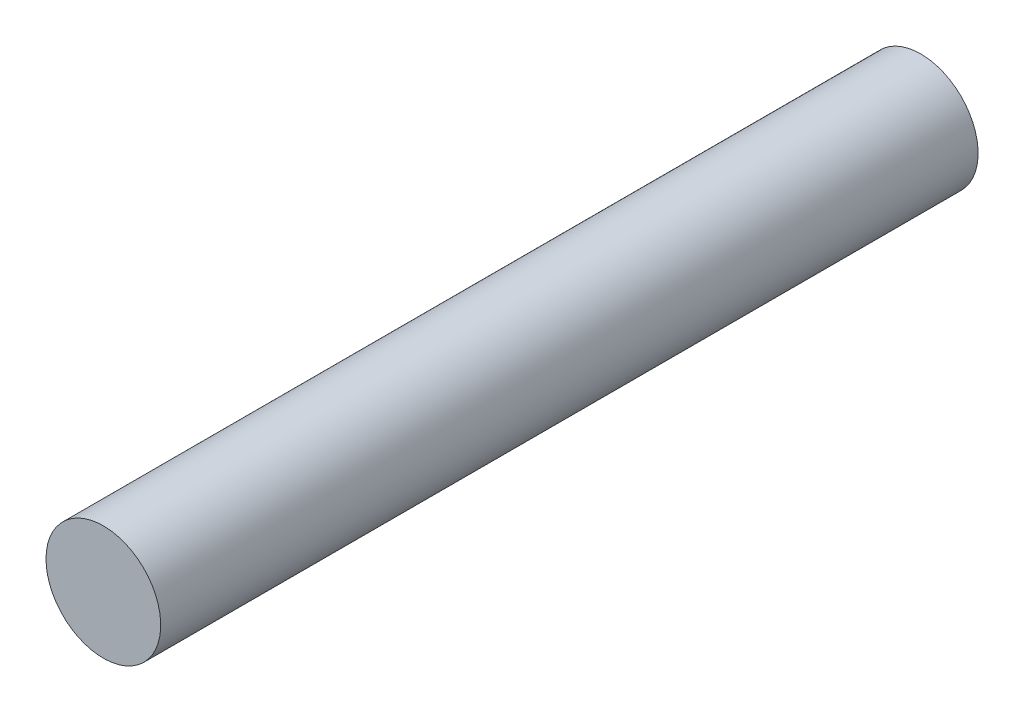
ISO-10303-21;
HEADER;
FILE_DESCRIPTION(('STEP AP214'),'2;1');
FILE_NAME('part.step','',(''),(''),'','','');
FILE_SCHEMA(('AUTOMOTIVE_DESIGN { 1 0 10303 214 1 1 1 1 }'));
ENDSEC;
DATA;
#1=APPLICATION_CONTEXT('core data for automotive mechanical design processes');
#2=APPLICATION_PROTOCOL_DEFINITION('international standard','automotive_design',2000,#1);
#3=PRODUCT_CONTEXT('',#1,'mechanical');
#4=PRODUCT('Part','Part','',(#3));
#5=PRODUCT_RELATED_PRODUCT_CATEGORY('part','',(#4));
#6=PRODUCT_DEFINITION_FORMATION('','',#4);
#7=PRODUCT_DEFINITION_CONTEXT('part definition',#1,'design');
#8=PRODUCT_DEFINITION('design','',#6,#7);
#9=PRODUCT_DEFINITION_SHAPE('','',#8);
#10=(LENGTH_UNIT() NAMED_UNIT(*) SI_UNIT(.MILLI.,.METRE.));
#11=(NAMED_UNIT(*) PLANE_ANGLE_UNIT() SI_UNIT($,.RADIAN.));
#12=(NAMED_UNIT(*) SI_UNIT($,.STERADIAN.) SOLID_ANGLE_UNIT());
#13=UNCERTAINTY_MEASURE_WITH_UNIT(LENGTH_MEASURE(1.E-05),#10,'distance_accuracy_value','');
#14=(GEOMETRIC_REPRESENTATION_CONTEXT(3) GLOBAL_UNCERTAINTY_ASSIGNED_CONTEXT((#13)) GLOBAL_UNIT_ASSIGNED_CONTEXT((#10,
#11,#12)) REPRESENTATION_CONTEXT('',''));
#15=CARTESIAN_POINT('',(0.,0.,0.));
#16=DIRECTION('',(0.,0.,1.));
#17=DIRECTION('',(1.,0.,0.));
#18=AXIS2_PLACEMENT_3D('',#15,#16,#17);
#19=CARTESIAN_POINT('',(0.,0.,57.));
#20=DIRECTION('',(0.,0.,-1.));
#21=DIRECTION('',(-1.,0.,0.));
#22=AXIS2_PLACEMENT_3D('',#19,#20,#21);
#23=CYLINDRICAL_SURFACE('',#22,4.);
#24=CARTESIAN_POINT('',(0.,0.,57.));
#25=DIRECTION('',(0.,0.,1.));
#26=DIRECTION('',(1.,0.,0.));
#27=AXIS2_PLACEMENT_3D('',#24,#25,#26);
#28=CIRCLE('',#27,4.);
#29=CARTESIAN_POINT('',(-4.,0.,57.));
#30=VERTEX_POINT('',#29);
#31=EDGE_CURVE('E10',#30,#30,#28,.T.);
#32=CARTESIAN_POINT('',(0.,0.,0.));
#33=DIRECTION('',(0.,0.,1.));
#34=DIRECTION('',(1.,0.,0.));
#35=AXIS2_PLACEMENT_3D('',#32,#33,#34);
#36=CIRCLE('',#35,4.);
#37=CARTESIAN_POINT('',(-4.,0.,0.));
#38=VERTEX_POINT('',#37);
#39=EDGE_CURVE('E32',#38,#38,#36,.T.);
#40=CARTESIAN_POINT('',(-4.,0.,57.));
#41=CARTESIAN_POINT('',(-4.,0.,56.40625));
#42=CARTESIAN_POINT('',(-4.,0.,55.8125));
#43=CARTESIAN_POINT('',(-4.,0.,54.625));
#44=CARTESIAN_POINT('',(-4.,0.,54.03125));
#45=CARTESIAN_POINT('',(-4.,0.,52.84375));
#46=CARTESIAN_POINT('',(-4.,0.,52.25));
#47=CARTESIAN_POINT('',(-4.,0.,51.0625));
#48=CARTESIAN_POINT('',(-4.,0.,50.46875));
#49=CARTESIAN_POINT('',(-4.,0.,49.28125));
#50=CARTESIAN_POINT('',(-4.,0.,48.6875));
#51=CARTESIAN_POINT('',(-4.,0.,47.5));
#52=CARTESIAN_POINT('',(-4.,0.,46.90625));
#53=CARTESIAN_POINT('',(-4.,0.,45.71875));
#54=CARTESIAN_POINT('',(-4.,0.,45.125));
#55=CARTESIAN_POINT('',(-4.,0.,43.9375));
#56=CARTESIAN_POINT('',(-4.,0.,43.34375));
#57=CARTESIAN_POINT('',(-4.,0.,42.15625));
#58=CARTESIAN_POINT('',(-4.,0.,41.5625));
#59=CARTESIAN_POINT('',(-4.,0.,40.375));
#60=CARTESIAN_POINT('',(-4.,0.,39.78125));
#61=CARTESIAN_POINT('',(-4.,0.,38.59375));
#62=CARTESIAN_POINT('',(-4.,0.,38.));
#63=CARTESIAN_POINT('',(-4.,0.,36.8125));
#64=CARTESIAN_POINT('',(-4.,0.,36.21875));
#65=CARTESIAN_POINT('',(-4.,0.,35.03125));
#66=CARTESIAN_POINT('',(-4.,0.,34.4375));
#67=CARTESIAN_POINT('',(-4.,0.,33.25));
#68=CARTESIAN_POINT('',(-4.,0.,32.65625));
#69=CARTESIAN_POINT('',(-4.,0.,31.46875));
#70=CARTESIAN_POINT('',(-4.,0.,30.875));
#71=CARTESIAN_POINT('',(-4.,0.,29.6875));
#72=CARTESIAN_POINT('',(-4.,0.,29.09375));
#73=CARTESIAN_POINT('',(-4.,0.,27.90625));
#74=CARTESIAN_POINT('',(-4.,0.,27.3125));
#75=CARTESIAN_POINT('',(-4.,0.,26.125));
#76=CARTESIAN_POINT('',(-4.,0.,25.53125));
#77=CARTESIAN_POINT('',(-4.,0.,24.34375));
#78=CARTESIAN_POINT('',(-4.,0.,23.75));
#79=CARTESIAN_POINT('',(-4.,0.,22.5625));
#80=CARTESIAN_POINT('',(-4.,0.,21.96875));
#81=CARTESIAN_POINT('',(-4.,0.,20.78125));
#82=CARTESIAN_POINT('',(-4.,0.,20.1875));
#83=CARTESIAN_POINT('',(-4.,0.,19.));
#84=CARTESIAN_POINT('',(-4.,0.,18.40625));
#85=CARTESIAN_POINT('',(-4.,0.,17.21875));
#86=CARTESIAN_POINT('',(-4.,0.,16.625));
#87=CARTESIAN_POINT('',(-4.,0.,15.4375));
#88=CARTESIAN_POINT('',(-4.,0.,14.84375));
#89=CARTESIAN_POINT('',(-4.,0.,13.65625));
#90=CARTESIAN_POINT('',(-4.,0.,13.0625));
#91=CARTESIAN_POINT('',(-4.,0.,11.875));
#92=CARTESIAN_POINT('',(-4.,0.,11.28125));
#93=CARTESIAN_POINT('',(-4.,0.,10.09375));
#94=CARTESIAN_POINT('',(-4.,0.,9.49999999999999));
#95=CARTESIAN_POINT('',(-4.,0.,8.31249999999999));
#96=CARTESIAN_POINT('',(-4.,0.,7.71874999999999));
#97=CARTESIAN_POINT('',(-4.,0.,6.53124999999999));
#98=CARTESIAN_POINT('',(-4.,0.,5.93749999999999));
#99=CARTESIAN_POINT('',(-4.,0.,4.74999999999999));
#100=CARTESIAN_POINT('',(-4.,0.,4.15624999999999));
#101=CARTESIAN_POINT('',(-4.,0.,2.96874999999999));
#102=CARTESIAN_POINT('',(-4.,0.,2.37499999999999));
#103=CARTESIAN_POINT('',(-4.,0.,1.18749999999999));
#104=CARTESIAN_POINT('',(-4.,0.,0.593749999999992));
#105=CARTESIAN_POINT('',(-4.,0.,0.));
#106=B_SPLINE_CURVE_WITH_KNOTS('',3,(#40,#41,#42,#43,#44,#45,#46,#47,#48,#49,#50,#51,#52,#53,
#54,#55,#56,#57,#58,#59,#60,#61,#62,#63,#64,#65,#66,#67,#68,#69,#70,#71,#72,#73,#74,#75,#76,#77,
#78,#79,#80,#81,#82,#83,#84,#85,#86,#87,#88,#89,#90,#91,#92,#93,#94,#95,#96,#97,#98,#99,#100,
#101,#102,#103,#104,#105),.UNSPECIFIED.,.F.,.F.,(4,2,2,2,2,2,2,2,2,2,2,2,2,2,2,2,2,2,2,2,2,2,2,
2,2,2,2,2,2,2,2,2,4),(0.,1.78125000000001,3.5625,5.34375,7.125,8.90625,10.6875,12.46875,14.25,
16.03125,17.8125,19.59375,21.375,23.15625,24.9375,26.71875,28.5,30.28125,32.0625,33.84375,
35.625,37.40625,39.1875,40.96875,42.75,44.53125,46.3125,48.09375,49.875,51.65625,53.4375,
55.21875,57.),.UNSPECIFIED.);
#107=EDGE_CURVE('BSEAM29',#30,#38,#106,.T.);
#108=ORIENTED_EDGE('',*,*,#31,.F.);
#109=ORIENTED_EDGE('',*,*,#39,.T.);
#110=ORIENTED_EDGE('',*,*,#107,.T.);
#111=ORIENTED_EDGE('',*,*,#107,.F.);
#112=EDGE_LOOP('',(#108,#110,#109,#111));
#113=FACE_BOUND('',#112,.T.);
#114=ADVANCED_FACE('F29',(#113),#23,.T.);
#115=CARTESIAN_POINT('',(0.,0.,57.));
#116=DIRECTION('',(0.,0.,1.));
#117=DIRECTION('',(1.,0.,0.));
#118=AXIS2_PLACEMENT_3D('',#115,#116,#117);
#119=PLANE('',#118);
#120=ORIENTED_EDGE('',*,*,#31,.T.);
#121=EDGE_LOOP('',(#120));
#122=FACE_BOUND('',#121,.T.);
#123=ADVANCED_FACE('F44',(#122),#119,.T.);
#124=CARTESIAN_POINT('',(0.,0.,0.));
#125=DIRECTION('',(0.,0.,1.));
#126=DIRECTION('',(1.,0.,0.));
#127=AXIS2_PLACEMENT_3D('',#124,#125,#126);
#128=PLANE('',#127);
#129=ORIENTED_EDGE('',*,*,#39,.F.);
#130=EDGE_LOOP('',(#129));
#131=FACE_BOUND('',#130,.T.);
#132=ADVANCED_FACE('F42',(#131),#128,.F.);
#133=CLOSED_SHELL('',(#114,#123,#132));
#134=MANIFOLD_SOLID_BREP('B2',#133);
#135=ADVANCED_BREP_SHAPE_REPRESENTATION('',(#18,#134),#14);
#136=SHAPE_DEFINITION_REPRESENTATION(#9,#135);
ENDSEC;
END-ISO-10303-21;
